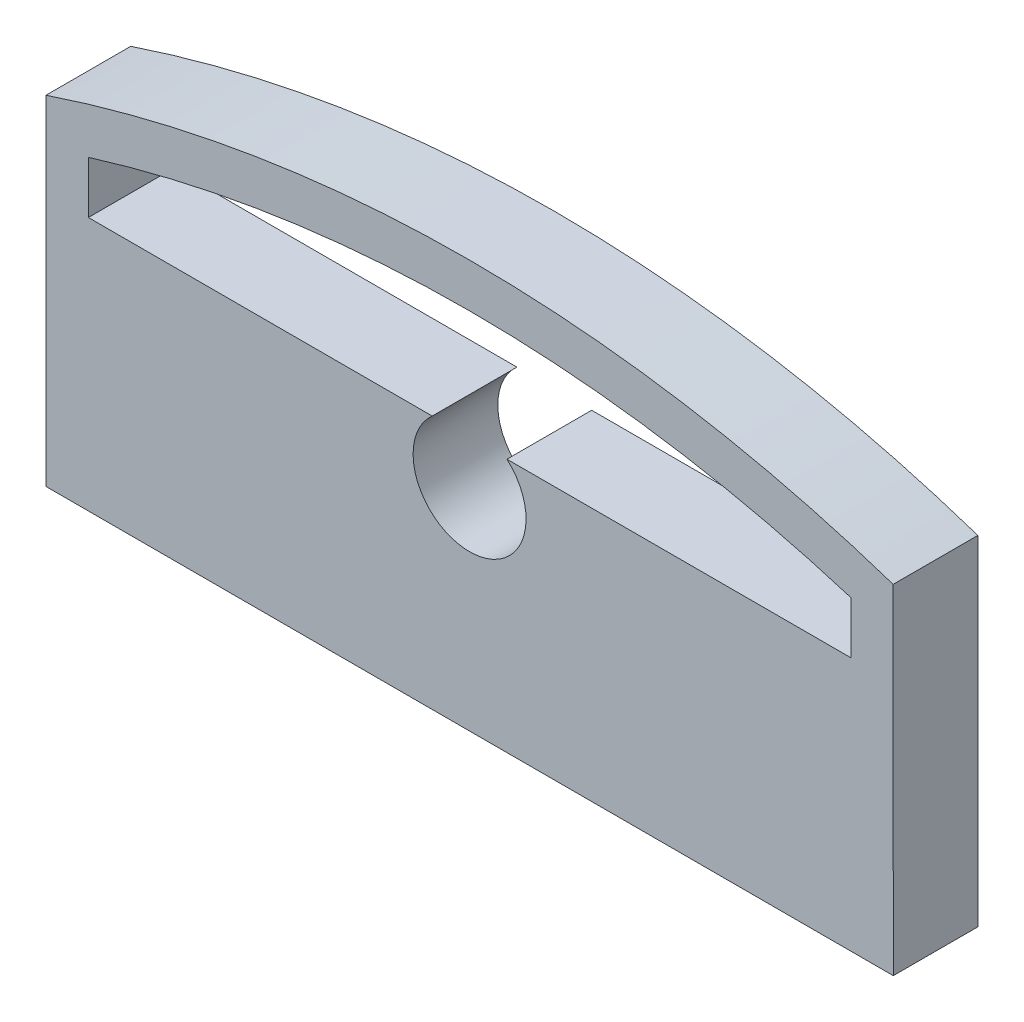
ISO-10303-21;
HEADER;
FILE_DESCRIPTION(('STEP AP214'),'2;1');
FILE_NAME('part.step','',(''),(''),'','','');
FILE_SCHEMA(('AUTOMOTIVE_DESIGN { 1 0 10303 214 1 1 1 1 }'));
ENDSEC;
DATA;
#1=APPLICATION_CONTEXT('core data for automotive mechanical design processes');
#2=APPLICATION_PROTOCOL_DEFINITION('international standard','automotive_design',2000,#1);
#3=PRODUCT_CONTEXT('',#1,'mechanical');
#4=PRODUCT('Part','Part','',(#3));
#5=PRODUCT_RELATED_PRODUCT_CATEGORY('part','',(#4));
#6=PRODUCT_DEFINITION_FORMATION('','',#4);
#7=PRODUCT_DEFINITION_CONTEXT('part definition',#1,'design');
#8=PRODUCT_DEFINITION('design','',#6,#7);
#9=PRODUCT_DEFINITION_SHAPE('','',#8);
#10=(LENGTH_UNIT() NAMED_UNIT(*) SI_UNIT(.MILLI.,.METRE.));
#11=(NAMED_UNIT(*) PLANE_ANGLE_UNIT() SI_UNIT($,.RADIAN.));
#12=(NAMED_UNIT(*) SI_UNIT($,.STERADIAN.) SOLID_ANGLE_UNIT());
#13=UNCERTAINTY_MEASURE_WITH_UNIT(LENGTH_MEASURE(1.E-05),#10,'distance_accuracy_value','');
#14=(GEOMETRIC_REPRESENTATION_CONTEXT(3) GLOBAL_UNCERTAINTY_ASSIGNED_CONTEXT((#13)) GLOBAL_UNIT_ASSIGNED_CONTEXT((#10,
#11,#12)) REPRESENTATION_CONTEXT('',''));
#15=CARTESIAN_POINT('',(0.,0.,0.));
#16=DIRECTION('',(0.,0.,1.));
#17=DIRECTION('',(1.,0.,0.));
#18=AXIS2_PLACEMENT_3D('',#15,#16,#17);
#19=CARTESIAN_POINT('',(42.2970585407784,90.,-25.));
#20=DIRECTION('',(0.,-1.,0.));
#21=DIRECTION('',(0.,0.,-1.));
#22=AXIS2_PLACEMENT_3D('',#19,#20,#21);
#23=PLANE('',#22);
#24=DIRECTION('',(1.,0.,0.));
#25=VECTOR('',#24,1.);
#26=CARTESIAN_POINT('',(42.2970585407784,90.,-10.));
#27=LINE('',#26,#25);
#28=CARTESIAN_POINT('',(2.64575131106459,90.,-10.));
#29=VERTEX_POINT('',#28);
#30=CARTESIAN_POINT('',(27.,90.,-10.));
#31=VERTEX_POINT('',#30);
#32=EDGE_CURVE('E230',#29,#31,#27,.T.);
#33=ORIENTED_EDGE('',*,*,#32,.F.);
#34=DIRECTION('',(0.,0.,1.));
#35=VECTOR('',#34,1.);
#36=CARTESIAN_POINT('',(2.64575131106459,90.,-15.));
#37=LINE('',#36,#35);
#38=CARTESIAN_POINT('',(2.64575131106459,90.,-4.));
#39=VERTEX_POINT('',#38);
#40=EDGE_CURVE('E163',#29,#39,#37,.T.);
#41=ORIENTED_EDGE('',*,*,#40,.T.);
#42=DIRECTION('',(1.,0.,0.));
#43=VECTOR('',#42,1.);
#44=CARTESIAN_POINT('',(-27.,90.,-4.));
#45=LINE('',#44,#43);
#46=CARTESIAN_POINT('',(27.,90.,-4.));
#47=VERTEX_POINT('',#46);
#48=EDGE_CURVE('E148',#39,#47,#45,.T.);
#49=ORIENTED_EDGE('',*,*,#48,.T.);
#50=DIRECTION('',(0.,0.,-1.));
#51=VECTOR('',#50,1.);
#52=CARTESIAN_POINT('',(27.,90.,-25.));
#53=LINE('',#52,#51);
#54=EDGE_CURVE('E165',#47,#31,#53,.T.);
#55=ORIENTED_EDGE('',*,*,#54,.T.);
#56=EDGE_LOOP('',(#33,#41,#49,#55));
#57=FACE_BOUND('',#56,.T.);
#58=ADVANCED_FACE('F61',(#57),#23,.F.);
#59=CARTESIAN_POINT('',(-27.,75.,-25.));
#60=DIRECTION('',(1.,0.,0.));
#61=DIRECTION('',(0.,0.,-1.));
#62=AXIS2_PLACEMENT_3D('',#59,#60,#61);
#63=PLANE('',#62);
#64=DIRECTION('',(0.,0.,1.));
#65=VECTOR('',#64,1.);
#66=CARTESIAN_POINT('',(-27.,90.,-25.));
#67=LINE('',#66,#65);
#68=CARTESIAN_POINT('',(-27.,90.,-10.));
#69=VERTEX_POINT('',#68);
#70=CARTESIAN_POINT('',(-27.,90.,-4.));
#71=VERTEX_POINT('',#70);
#72=EDGE_CURVE('E162',#69,#71,#67,.T.);
#73=ORIENTED_EDGE('',*,*,#72,.F.);
#74=DIRECTION('',(0.,1.,0.));
#75=VECTOR('',#74,1.);
#76=CARTESIAN_POINT('',(-27.,75.,-10.));
#77=LINE('',#76,#75);
#78=CARTESIAN_POINT('',(-27.,93.6919210733854,-10.));
#79=VERTEX_POINT('',#78);
#80=EDGE_CURVE('E229',#69,#79,#77,.T.);
#81=ORIENTED_EDGE('',*,*,#80,.T.);
#82=DIRECTION('',(0.,0.,-1.));
#83=VECTOR('',#82,1.);
#84=CARTESIAN_POINT('',(-27.,93.6919210733854,-4.));
#85=LINE('',#84,#83);
#86=CARTESIAN_POINT('',(-27.,93.6919210733854,-4.));
#87=VERTEX_POINT('',#86);
#88=EDGE_CURVE('E183',#87,#79,#85,.T.);
#89=ORIENTED_EDGE('',*,*,#88,.F.);
#90=DIRECTION('',(0.,-1.,0.));
#91=VECTOR('',#90,1.);
#92=CARTESIAN_POINT('',(-27.,93.6919210733854,-4.));
#93=LINE('',#92,#91);
#94=EDGE_CURVE('E189',#87,#71,#93,.T.);
#95=ORIENTED_EDGE('',*,*,#94,.T.);
#96=EDGE_LOOP('',(#73,#81,#89,#95));
#97=FACE_BOUND('',#96,.T.);
#98=ADVANCED_FACE('F220',(#97),#63,.T.);
#99=CARTESIAN_POINT('',(27.,75.,-25.));
#100=DIRECTION('',(-1.,0.,0.));
#101=DIRECTION('',(0.,0.,1.));
#102=AXIS2_PLACEMENT_3D('',#99,#100,#101);
#103=PLANE('',#102);
#104=DIRECTION('',(0.,0.,-1.));
#105=VECTOR('',#104,1.);
#106=CARTESIAN_POINT('',(27.,93.6919210733854,-4.));
#107=LINE('',#106,#105);
#108=CARTESIAN_POINT('',(27.,93.6919210733854,-4.));
#109=VERTEX_POINT('',#108);
#110=CARTESIAN_POINT('',(27.,93.6919210733854,-10.));
#111=VERTEX_POINT('',#110);
#112=EDGE_CURVE('E176',#109,#111,#107,.T.);
#113=ORIENTED_EDGE('',*,*,#112,.T.);
#114=DIRECTION('',(0.,-1.,0.));
#115=VECTOR('',#114,1.);
#116=CARTESIAN_POINT('',(27.,75.,-10.));
#117=LINE('',#116,#115);
#118=EDGE_CURVE('E157',#111,#31,#117,.T.);
#119=ORIENTED_EDGE('',*,*,#118,.T.);
#120=ORIENTED_EDGE('',*,*,#54,.F.);
#121=DIRECTION('',(0.,1.,0.));
#122=VECTOR('',#121,1.);
#123=CARTESIAN_POINT('',(27.,90.,-4.));
#124=LINE('',#123,#122);
#125=EDGE_CURVE('E212',#47,#109,#124,.T.);
#126=ORIENTED_EDGE('',*,*,#125,.T.);
#127=EDGE_LOOP('',(#113,#119,#120,#126));
#128=FACE_BOUND('',#127,.T.);
#129=ADVANCED_FACE('F241',(#128),#103,.T.);
#130=CARTESIAN_POINT('',(-30.,75.,-25.));
#131=DIRECTION('',(1.,0.,0.));
#132=DIRECTION('',(0.,0.,-1.));
#133=AXIS2_PLACEMENT_3D('',#130,#131,#132);
#134=PLANE('',#133);
#135=DIRECTION('',(0.,1.,0.));
#136=VECTOR('',#135,1.);
#137=CARTESIAN_POINT('',(-30.,70.2256964141992,-10.));
#138=LINE('',#137,#136);
#139=CARTESIAN_POINT('',(-30.,72.,-10.));
#140=VERTEX_POINT('',#139);
#141=CARTESIAN_POINT('',(-30.,96.,-10.));
#142=VERTEX_POINT('',#141);
#143=EDGE_CURVE('E141',#140,#142,#138,.T.);
#144=ORIENTED_EDGE('',*,*,#143,.F.);
#145=DIRECTION('',(0.,0.,-1.));
#146=VECTOR('',#145,1.);
#147=CARTESIAN_POINT('',(-30.,72.,-25.));
#148=LINE('',#147,#146);
#149=CARTESIAN_POINT('',(-30.,72.,-4.));
#150=VERTEX_POINT('',#149);
#151=EDGE_CURVE('E152',#150,#140,#148,.T.);
#152=ORIENTED_EDGE('',*,*,#151,.F.);
#153=DIRECTION('',(0.,-1.,0.));
#154=VECTOR('',#153,1.);
#155=CARTESIAN_POINT('',(-30.,96.,-4.));
#156=LINE('',#155,#154);
#157=CARTESIAN_POINT('',(-30.,96.,-4.));
#158=VERTEX_POINT('',#157);
#159=EDGE_CURVE('E180',#158,#150,#156,.T.);
#160=ORIENTED_EDGE('',*,*,#159,.F.);
#161=DIRECTION('',(0.,0.,-1.));
#162=VECTOR('',#161,1.);
#163=CARTESIAN_POINT('',(-30.,96.,-4.));
#164=LINE('',#163,#162);
#165=EDGE_CURVE('E155',#158,#142,#164,.T.);
#166=ORIENTED_EDGE('',*,*,#165,.T.);
#167=EDGE_LOOP('',(#144,#152,#160,#166));
#168=FACE_BOUND('',#167,.T.);
#169=ADVANCED_FACE('F63',(#168),#134,.F.);
#170=DIRECTION('',(1.,0.,0.));
#171=VECTOR('',#170,1.);
#172=CARTESIAN_POINT('',(42.2970585407784,90.,-10.));
#173=LINE('',#172,#171);
#174=CARTESIAN_POINT('',(-2.64575131106459,90.,-10.));
#175=VERTEX_POINT('',#174);
#176=EDGE_CURVE('E149',#69,#175,#173,.T.);
#177=ORIENTED_EDGE('',*,*,#176,.F.);
#178=ORIENTED_EDGE('',*,*,#72,.T.);
#179=CARTESIAN_POINT('',(-2.64575131106459,90.,-4.));
#180=VERTEX_POINT('',#179);
#181=EDGE_CURVE('E208',#71,#180,#45,.T.);
#182=ORIENTED_EDGE('',*,*,#181,.T.);
#183=DIRECTION('',(0.,0.,1.));
#184=VECTOR('',#183,1.);
#185=CARTESIAN_POINT('',(-2.64575131106459,90.,-15.));
#186=LINE('',#185,#184);
#187=EDGE_CURVE('E78',#180,#175,#186,.F.);
#188=ORIENTED_EDGE('',*,*,#187,.T.);
#189=EDGE_LOOP('',(#177,#178,#182,#188));
#190=FACE_BOUND('',#189,.T.);
#191=ADVANCED_FACE('F205',(#190),#23,.F.);
#192=CARTESIAN_POINT('',(0.,72.,0.));
#193=DIRECTION('',(0.,1.,0.));
#194=DIRECTION('',(0.,0.,1.));
#195=AXIS2_PLACEMENT_3D('',#192,#193,#194);
#196=PLANE('',#195);
#197=DIRECTION('',(-1.,0.,0.));
#198=VECTOR('',#197,1.);
#199=CARTESIAN_POINT('',(0.,72.,-10.));
#200=LINE('',#199,#198);
#201=CARTESIAN_POINT('',(30.0091020822686,72.,-10.));
#202=VERTEX_POINT('',#201);
#203=EDGE_CURVE('E136',#202,#140,#200,.T.);
#204=ORIENTED_EDGE('',*,*,#203,.F.);
#205=DIRECTION('',(0.,0.,-1.));
#206=VECTOR('',#205,1.);
#207=CARTESIAN_POINT('',(30.0091020822686,72.,-4.));
#208=LINE('',#207,#206);
#209=CARTESIAN_POINT('',(30.0091020822686,72.,-4.));
#210=VERTEX_POINT('',#209);
#211=EDGE_CURVE('E200',#210,#202,#208,.T.);
#212=ORIENTED_EDGE('',*,*,#211,.F.);
#213=DIRECTION('',(1.,0.,0.));
#214=VECTOR('',#213,1.);
#215=CARTESIAN_POINT('',(-30.,72.,-4.));
#216=LINE('',#215,#214);
#217=EDGE_CURVE('E161',#150,#210,#216,.T.);
#218=ORIENTED_EDGE('',*,*,#217,.F.);
#219=ORIENTED_EDGE('',*,*,#151,.T.);
#220=EDGE_LOOP('',(#204,#212,#218,#219));
#221=FACE_BOUND('',#220,.T.);
#222=ADVANCED_FACE('F160',(#221),#196,.F.);
#223=CARTESIAN_POINT('',(0.,87.,-15.));
#224=DIRECTION('',(0.,0.,1.));
#225=DIRECTION('',(1.,0.,0.));
#226=AXIS2_PLACEMENT_3D('',#223,#224,#225);
#227=CYLINDRICAL_SURFACE('',#226,4.);
#228=CARTESIAN_POINT('',(0.,87.,-10.));
#229=DIRECTION('',(0.,0.,-1.));
#230=DIRECTION('',(-1.,0.,0.));
#231=AXIS2_PLACEMENT_3D('',#228,#229,#230);
#232=CIRCLE('',#231,4.);
#233=EDGE_CURVE('E232',#175,#29,#232,.F.);
#234=ORIENTED_EDGE('',*,*,#233,.F.);
#235=ORIENTED_EDGE('',*,*,#187,.F.);
#236=CARTESIAN_POINT('',(0.,87.,-4.));
#237=DIRECTION('',(0.,0.,1.));
#238=DIRECTION('',(1.,0.,0.));
#239=AXIS2_PLACEMENT_3D('',#236,#237,#238);
#240=CIRCLE('',#239,4.);
#241=EDGE_CURVE('E12',#180,#39,#240,.T.);
#242=ORIENTED_EDGE('',*,*,#241,.T.);
#243=ORIENTED_EDGE('',*,*,#40,.F.);
#244=EDGE_LOOP('',(#234,#235,#242,#243));
#245=FACE_BOUND('',#244,.T.);
#246=ADVANCED_FACE('F238',(#245),#227,.F.);
#247=CARTESIAN_POINT('',(0.,6.41436476288712,-10.));
#248=DIRECTION('',(0.,0.,1.));
#249=DIRECTION('',(1.,0.,0.));
#250=AXIS2_PLACEMENT_3D('',#247,#248,#249);
#251=PLANE('',#250);
#252=CARTESIAN_POINT('',(0.,6.41436476288706,-10.));
#253=DIRECTION('',(0.,0.,-1.));
#254=DIRECTION('',(1.,0.,0.));
#255=AXIS2_PLACEMENT_3D('',#252,#253,#254);
#256=CIRCLE('',#255,94.4753197445611);
#257=CARTESIAN_POINT('',(30.,96.,-10.));
#258=VERTEX_POINT('',#257);
#259=EDGE_CURVE('E71',#142,#258,#256,.T.);
#260=ORIENTED_EDGE('',*,*,#259,.T.);
#261=DIRECTION('',(0.000379253400583379,-0.999999928083427,0.));
#262=VECTOR('',#261,1.);
#263=CARTESIAN_POINT('',(30.0091020822686,72.,-10.));
#264=LINE('',#263,#262);
#265=EDGE_CURVE('E143',#202,#258,#264,.F.);
#266=ORIENTED_EDGE('',*,*,#265,.F.);
#267=ORIENTED_EDGE('',*,*,#203,.T.);
#268=ORIENTED_EDGE('',*,*,#143,.T.);
#269=EDGE_LOOP('',(#260,#266,#267,#268));
#270=FACE_BOUND('',#269,.T.);
#271=ORIENTED_EDGE('',*,*,#176,.T.);
#272=ORIENTED_EDGE('',*,*,#233,.T.);
#273=ORIENTED_EDGE('',*,*,#32,.T.);
#274=ORIENTED_EDGE('',*,*,#118,.F.);
#275=CARTESIAN_POINT('',(0.,6.41436476288706,-10.));
#276=DIRECTION('',(0.,0.,-1.));
#277=DIRECTION('',(-1.,0.,0.));
#278=AXIS2_PLACEMENT_3D('',#275,#276,#277);
#279=CIRCLE('',#278,91.3584798227959);
#280=EDGE_CURVE('E172',#79,#111,#279,.T.);
#281=ORIENTED_EDGE('',*,*,#280,.F.);
#282=ORIENTED_EDGE('',*,*,#80,.F.);
#283=EDGE_LOOP('',(#271,#272,#273,#274,#281,#282));
#284=FACE_BOUND('',#283,.T.);
#285=ADVANCED_FACE('F139',(#270,#284),#251,.F.);
#286=CARTESIAN_POINT('',(0.,6.41436476288712,-4.));
#287=DIRECTION('',(0.,0.,1.));
#288=DIRECTION('',(1.,0.,0.));
#289=AXIS2_PLACEMENT_3D('',#286,#287,#288);
#290=PLANE('',#289);
#291=ORIENTED_EDGE('',*,*,#241,.F.);
#292=ORIENTED_EDGE('',*,*,#181,.F.);
#293=ORIENTED_EDGE('',*,*,#94,.F.);
#294=CARTESIAN_POINT('',(0.,6.414364762887,-4.));
#295=DIRECTION('',(0.,0.,1.));
#296=DIRECTION('',(1.,0.,0.));
#297=AXIS2_PLACEMENT_3D('',#294,#295,#296);
#298=CIRCLE('',#297,91.358479822796);
#299=EDGE_CURVE('E214',#109,#87,#298,.T.);
#300=ORIENTED_EDGE('',*,*,#299,.F.);
#301=ORIENTED_EDGE('',*,*,#125,.F.);
#302=ORIENTED_EDGE('',*,*,#48,.F.);
#303=EDGE_LOOP('',(#291,#292,#293,#300,#301,#302));
#304=FACE_BOUND('',#303,.T.);
#305=CARTESIAN_POINT('',(0.,6.41436476288712,-4.));
#306=DIRECTION('',(0.,0.,1.));
#307=DIRECTION('',(1.,0.,0.));
#308=AXIS2_PLACEMENT_3D('',#305,#306,#307);
#309=CIRCLE('',#308,94.475319744561);
#310=CARTESIAN_POINT('',(30.,96.,-4.));
#311=VERTEX_POINT('',#310);
#312=EDGE_CURVE('E175',#311,#158,#309,.T.);
#313=ORIENTED_EDGE('',*,*,#312,.T.);
#314=ORIENTED_EDGE('',*,*,#159,.T.);
#315=ORIENTED_EDGE('',*,*,#217,.T.);
#316=DIRECTION('',(-0.000379253400583379,0.999999928083427,0.));
#317=VECTOR('',#316,1.);
#318=CARTESIAN_POINT('',(30.0091020822686,72.,-4.));
#319=LINE('',#318,#317);
#320=EDGE_CURVE('E195',#210,#311,#319,.T.);
#321=ORIENTED_EDGE('',*,*,#320,.T.);
#322=EDGE_LOOP('',(#313,#314,#315,#321));
#323=FACE_BOUND('',#322,.T.);
#324=ADVANCED_FACE('F223',(#304,#323),#290,.T.);
#325=CARTESIAN_POINT('',(0.,6.41436476288712,-4.));
#326=DIRECTION('',(0.,0.,-1.));
#327=DIRECTION('',(-1.,0.,0.));
#328=AXIS2_PLACEMENT_3D('',#325,#326,#327);
#329=CYLINDRICAL_SURFACE('',#328,94.475319744561);
#330=ORIENTED_EDGE('',*,*,#259,.F.);
#331=ORIENTED_EDGE('',*,*,#165,.F.);
#332=ORIENTED_EDGE('',*,*,#312,.F.);
#333=DIRECTION('',(0.,0.,-1.));
#334=VECTOR('',#333,1.);
#335=CARTESIAN_POINT('',(30.,96.,-4.));
#336=LINE('',#335,#334);
#337=EDGE_CURVE('E197',#311,#258,#336,.T.);
#338=ORIENTED_EDGE('',*,*,#337,.T.);
#339=EDGE_LOOP('',(#330,#331,#332,#338));
#340=FACE_BOUND('',#339,.T.);
#341=ADVANCED_FACE('F263',(#340),#329,.T.);
#342=CARTESIAN_POINT('',(30.0091020822686,72.,-4.));
#343=DIRECTION('',(-0.999999928083426,-0.000379253400583378,0.));
#344=DIRECTION('',(0.000379253400583379,-0.999999928083427,0.));
#345=AXIS2_PLACEMENT_3D('',#342,#343,#344);
#346=PLANE('',#345);
#347=ORIENTED_EDGE('',*,*,#265,.T.);
#348=ORIENTED_EDGE('',*,*,#337,.F.);
#349=ORIENTED_EDGE('',*,*,#320,.F.);
#350=ORIENTED_EDGE('',*,*,#211,.T.);
#351=EDGE_LOOP('',(#347,#348,#349,#350));
#352=FACE_BOUND('',#351,.T.);
#353=ADVANCED_FACE('F266',(#352),#346,.F.);
#354=CARTESIAN_POINT('',(0.,6.414364762887,-4.));
#355=DIRECTION('',(0.,0.,-1.));
#356=DIRECTION('',(-1.,0.,0.));
#357=AXIS2_PLACEMENT_3D('',#354,#355,#356);
#358=CYLINDRICAL_SURFACE('',#357,91.358479822796);
#359=ORIENTED_EDGE('',*,*,#280,.T.);
#360=ORIENTED_EDGE('',*,*,#112,.F.);
#361=ORIENTED_EDGE('',*,*,#299,.T.);
#362=ORIENTED_EDGE('',*,*,#88,.T.);
#363=EDGE_LOOP('',(#359,#360,#361,#362));
#364=FACE_BOUND('',#363,.T.);
#365=ADVANCED_FACE('F228',(#364),#358,.F.);
#366=CLOSED_SHELL('',(#58,#98,#129,#169,#191,#222,#246,#285,#324,#341,#353,#365));
#367=MANIFOLD_SOLID_BREP('B2',#366);
#368=ADVANCED_BREP_SHAPE_REPRESENTATION('',(#18,#367),#14);
#369=SHAPE_DEFINITION_REPRESENTATION(#9,#368);
ENDSEC;
END-ISO-10303-21;
